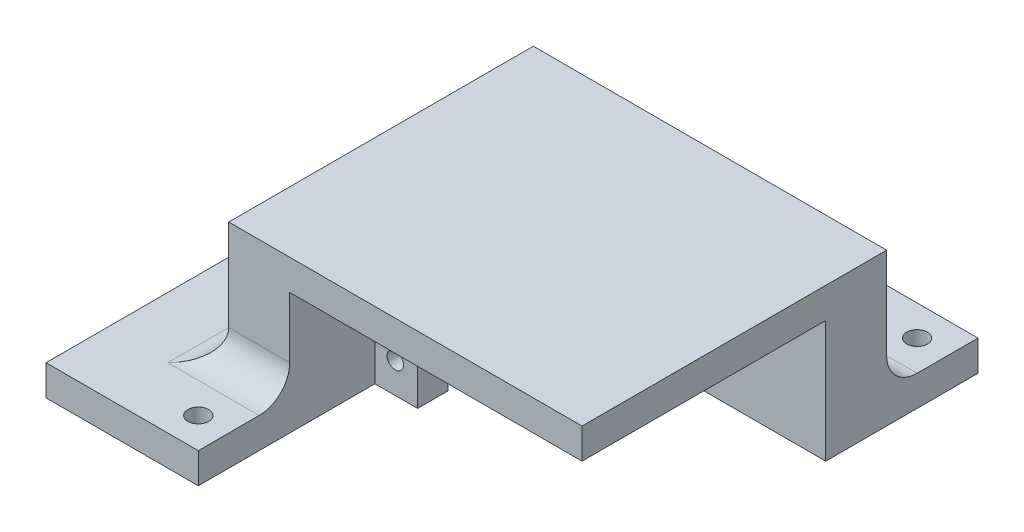
ISO-10303-21;
HEADER;
FILE_DESCRIPTION(('STEP AP214'),'2;1');
FILE_NAME('part.step','',(''),(''),'','','');
FILE_SCHEMA(('AUTOMOTIVE_DESIGN { 1 0 10303 214 1 1 1 1 }'));
ENDSEC;
DATA;
#1=APPLICATION_CONTEXT('core data for automotive mechanical design processes');
#2=APPLICATION_PROTOCOL_DEFINITION('international standard','automotive_design',2000,#1);
#3=PRODUCT_CONTEXT('',#1,'mechanical');
#4=PRODUCT('Part','Part','',(#3));
#5=PRODUCT_RELATED_PRODUCT_CATEGORY('part','',(#4));
#6=PRODUCT_DEFINITION_FORMATION('','',#4);
#7=PRODUCT_DEFINITION_CONTEXT('part definition',#1,'design');
#8=PRODUCT_DEFINITION('design','',#6,#7);
#9=PRODUCT_DEFINITION_SHAPE('','',#8);
#10=(LENGTH_UNIT() NAMED_UNIT(*) SI_UNIT(.MILLI.,.METRE.));
#11=(NAMED_UNIT(*) PLANE_ANGLE_UNIT() SI_UNIT($,.RADIAN.));
#12=(NAMED_UNIT(*) SI_UNIT($,.STERADIAN.) SOLID_ANGLE_UNIT());
#13=UNCERTAINTY_MEASURE_WITH_UNIT(LENGTH_MEASURE(1.E-05),#10,'distance_accuracy_value','');
#14=(GEOMETRIC_REPRESENTATION_CONTEXT(3) GLOBAL_UNCERTAINTY_ASSIGNED_CONTEXT((#13)) GLOBAL_UNIT_ASSIGNED_CONTEXT((#10,
#11,#12)) REPRESENTATION_CONTEXT('',''));
#15=CARTESIAN_POINT('',(0.,0.,0.));
#16=DIRECTION('',(0.,0.,1.));
#17=DIRECTION('',(1.,0.,0.));
#18=AXIS2_PLACEMENT_3D('',#15,#16,#17);
#19=CARTESIAN_POINT('',(-24.,5.,0.));
#20=DIRECTION('',(-1.,0.,0.));
#21=DIRECTION('',(0.,0.,1.));
#22=AXIS2_PLACEMENT_3D('',#19,#20,#21);
#23=PLANE('',#22);
#24=DIRECTION('',(0.,-1.,0.));
#25=VECTOR('',#24,1.);
#26=CARTESIAN_POINT('',(-24.,20.,-1.5));
#27=LINE('',#26,#25);
#28=CARTESIAN_POINT('',(-24.,20.,-1.5));
#29=VERTEX_POINT('',#28);
#30=CARTESIAN_POINT('',(-24.,0.,-1.5));
#31=VERTEX_POINT('',#30);
#32=EDGE_CURVE('E182',#29,#31,#27,.T.);
#33=ORIENTED_EDGE('',*,*,#32,.F.);
#34=DIRECTION('',(0.,0.,-1.));
#35=VECTOR('',#34,1.);
#36=CARTESIAN_POINT('',(-24.,20.,0.));
#37=LINE('',#36,#35);
#38=CARTESIAN_POINT('',(-24.,20.,12.5));
#39=VERTEX_POINT('',#38);
#40=EDGE_CURVE('E209',#39,#29,#37,.T.);
#41=ORIENTED_EDGE('',*,*,#40,.F.);
#42=DIRECTION('',(0.,-1.,0.));
#43=VECTOR('',#42,1.);
#44=CARTESIAN_POINT('',(-24.,20.,12.5));
#45=LINE('',#44,#43);
#46=CARTESIAN_POINT('',(-24.,10.,12.5));
#47=VERTEX_POINT('',#46);
#48=EDGE_CURVE('E215',#39,#47,#45,.T.);
#49=ORIENTED_EDGE('',*,*,#48,.T.);
#50=CARTESIAN_POINT('',(-24.,10.,17.5));
#51=DIRECTION('',(-1.,0.,0.));
#52=DIRECTION('',(0.,0.,1.));
#53=AXIS2_PLACEMENT_3D('',#50,#51,#52);
#54=CIRCLE('',#53,5.);
#55=CARTESIAN_POINT('',(-24.,5.,17.5));
#56=VERTEX_POINT('',#55);
#57=EDGE_CURVE('E11',#47,#56,#54,.T.);
#58=ORIENTED_EDGE('',*,*,#57,.T.);
#59=DIRECTION('',(0.,0.,-1.));
#60=VECTOR('',#59,1.);
#61=CARTESIAN_POINT('',(-24.,5.,0.));
#62=LINE('',#61,#60);
#63=CARTESIAN_POINT('',(-24.,5.,27.5));
#64=VERTEX_POINT('',#63);
#65=EDGE_CURVE('E236',#64,#56,#62,.T.);
#66=ORIENTED_EDGE('',*,*,#65,.F.);
#67=DIRECTION('',(0.,-1.,0.));
#68=VECTOR('',#67,1.);
#69=CARTESIAN_POINT('',(-24.,5.,27.5));
#70=LINE('',#69,#68);
#71=CARTESIAN_POINT('',(-24.,0.,27.5));
#72=VERTEX_POINT('',#71);
#73=EDGE_CURVE('E278',#64,#72,#70,.T.);
#74=ORIENTED_EDGE('',*,*,#73,.T.);
#75=DIRECTION('',(0.,0.,-1.));
#76=VECTOR('',#75,1.);
#77=CARTESIAN_POINT('',(-24.,0.,0.));
#78=LINE('',#77,#76);
#79=EDGE_CURVE('E259',#72,#31,#78,.T.);
#80=ORIENTED_EDGE('',*,*,#79,.T.);
#81=EDGE_LOOP('',(#33,#41,#49,#58,#66,#74,#80));
#82=FACE_BOUND('',#81,.T.);
#83=ADVANCED_FACE('F35',(#82),#23,.F.);
#84=DIRECTION('',(0.,1.,0.));
#85=VECTOR('',#84,1.);
#86=CARTESIAN_POINT('',(-24.,20.,-6.5));
#87=LINE('',#86,#85);
#88=CARTESIAN_POINT('',(-24.,0.,-6.5));
#89=VERTEX_POINT('',#88);
#90=CARTESIAN_POINT('',(-24.,20.,-6.5));
#91=VERTEX_POINT('',#90);
#92=EDGE_CURVE('E178',#89,#91,#87,.T.);
#93=ORIENTED_EDGE('',*,*,#92,.F.);
#94=CARTESIAN_POINT('',(-24.,0.,-27.5));
#95=VERTEX_POINT('',#94);
#96=EDGE_CURVE('E258',#89,#95,#78,.T.);
#97=ORIENTED_EDGE('',*,*,#96,.T.);
#98=DIRECTION('',(0.,-1.,0.));
#99=VECTOR('',#98,1.);
#100=CARTESIAN_POINT('',(-24.,5.,-27.5));
#101=LINE('',#100,#99);
#102=CARTESIAN_POINT('',(-24.,20.,-27.5));
#103=VERTEX_POINT('',#102);
#104=EDGE_CURVE('E275',#103,#95,#101,.T.);
#105=ORIENTED_EDGE('',*,*,#104,.F.);
#106=EDGE_CURVE('E208',#91,#103,#37,.T.);
#107=ORIENTED_EDGE('',*,*,#106,.F.);
#108=EDGE_LOOP('',(#93,#97,#105,#107));
#109=FACE_BOUND('',#108,.T.);
#110=ADVANCED_FACE('F333',(#109),#23,.F.);
#111=CARTESIAN_POINT('',(0.,20.,0.));
#112=DIRECTION('',(0.,1.,0.));
#113=DIRECTION('',(0.,0.,1.));
#114=AXIS2_PLACEMENT_3D('',#111,#112,#113);
#115=PLANE('',#114);
#116=DIRECTION('',(-1.,0.,0.));
#117=VECTOR('',#116,1.);
#118=CARTESIAN_POINT('',(-17.,20.,-1.5));
#119=LINE('',#118,#117);
#120=CARTESIAN_POINT('',(-17.,20.,-1.5));
#121=VERTEX_POINT('',#120);
#122=EDGE_CURVE('E322',#121,#29,#119,.T.);
#123=ORIENTED_EDGE('',*,*,#122,.F.);
#124=DIRECTION('',(0.,0.,1.));
#125=VECTOR('',#124,1.);
#126=CARTESIAN_POINT('',(-17.,20.,-1.5));
#127=LINE('',#126,#125);
#128=CARTESIAN_POINT('',(-17.,20.,-6.5));
#129=VERTEX_POINT('',#128);
#130=EDGE_CURVE('E175',#129,#121,#127,.T.);
#131=ORIENTED_EDGE('',*,*,#130,.F.);
#132=DIRECTION('',(-1.,0.,0.));
#133=VECTOR('',#132,1.);
#134=CARTESIAN_POINT('',(-17.,20.,-6.5));
#135=LINE('',#134,#133);
#136=EDGE_CURVE('E188',#129,#91,#135,.T.);
#137=ORIENTED_EDGE('',*,*,#136,.T.);
#138=ORIENTED_EDGE('',*,*,#106,.T.);
#139=DIRECTION('',(1.,0.,0.));
#140=VECTOR('',#139,1.);
#141=CARTESIAN_POINT('',(0.,20.,-27.5));
#142=LINE('',#141,#140);
#143=CARTESIAN_POINT('',(24.,20.,-27.5));
#144=VERTEX_POINT('',#143);
#145=EDGE_CURVE('E212',#103,#144,#142,.T.);
#146=ORIENTED_EDGE('',*,*,#145,.T.);
#147=DIRECTION('',(0.,0.,-1.));
#148=VECTOR('',#147,1.);
#149=CARTESIAN_POINT('',(24.,20.,-37.5));
#150=LINE('',#149,#148);
#151=CARTESIAN_POINT('',(24.,20.,12.5));
#152=VERTEX_POINT('',#151);
#153=EDGE_CURVE('E186',#152,#144,#150,.T.);
#154=ORIENTED_EDGE('',*,*,#153,.F.);
#155=DIRECTION('',(1.,0.,0.));
#156=VECTOR('',#155,1.);
#157=CARTESIAN_POINT('',(-34.,20.,12.5));
#158=LINE('',#157,#156);
#159=EDGE_CURVE('E184',#39,#152,#158,.T.);
#160=ORIENTED_EDGE('',*,*,#159,.F.);
#161=ORIENTED_EDGE('',*,*,#40,.T.);
#162=EDGE_LOOP('',(#123,#131,#137,#138,#146,#154,#160,#161));
#163=FACE_BOUND('',#162,.T.);
#164=ADVANCED_FACE('F328',(#163),#115,.F.);
#165=CARTESIAN_POINT('',(0.,5.,0.));
#166=DIRECTION('',(0.,1.,0.));
#167=DIRECTION('',(0.,0.,1.));
#168=AXIS2_PLACEMENT_3D('',#165,#166,#167);
#169=PLANE('',#168);
#170=CARTESIAN_POINT('',(19.,5.,-47.5));
#171=DIRECTION('',(0.,1.,0.));
#172=DIRECTION('',(0.,0.,1.));
#173=AXIS2_PLACEMENT_3D('',#170,#171,#172);
#174=CIRCLE('',#173,1.7);
#175=CARTESIAN_POINT('',(19.,5.,-45.8));
#176=VERTEX_POINT('',#175);
#177=EDGE_CURVE('E225',#176,#176,#174,.T.);
#178=ORIENTED_EDGE('',*,*,#177,.F.);
#179=EDGE_LOOP('',(#178));
#180=FACE_BOUND('',#179,.T.);
#181=CARTESIAN_POINT('',(-44.,5.,-47.5));
#182=DIRECTION('',(0.,1.,0.));
#183=DIRECTION('',(0.,0.,1.));
#184=AXIS2_PLACEMENT_3D('',#181,#182,#183);
#185=CIRCLE('',#184,1.7);
#186=CARTESIAN_POINT('',(-44.,5.,-45.8));
#187=VERTEX_POINT('',#186);
#188=EDGE_CURVE('E241',#187,#187,#185,.T.);
#189=ORIENTED_EDGE('',*,*,#188,.F.);
#190=EDGE_LOOP('',(#189));
#191=FACE_BOUND('',#190,.T.);
#192=CARTESIAN_POINT('',(-29.,5.,22.5));
#193=DIRECTION('',(0.,1.,0.));
#194=DIRECTION('',(0.,0.,1.));
#195=AXIS2_PLACEMENT_3D('',#192,#193,#194);
#196=CIRCLE('',#195,1.7);
#197=CARTESIAN_POINT('',(-29.,5.,24.2));
#198=VERTEX_POINT('',#197);
#199=EDGE_CURVE('E244',#198,#198,#196,.T.);
#200=ORIENTED_EDGE('',*,*,#199,.F.);
#201=EDGE_LOOP('',(#200));
#202=FACE_BOUND('',#201,.T.);
#203=DIRECTION('',(0.,0.,-1.));
#204=VECTOR('',#203,1.);
#205=CARTESIAN_POINT('',(-39.,5.,-37.5));
#206=LINE('',#205,#204);
#207=CARTESIAN_POINT('',(-39.,5.,17.5));
#208=VERTEX_POINT('',#207);
#209=CARTESIAN_POINT('',(-39.,5.,-42.5));
#210=VERTEX_POINT('',#209);
#211=EDGE_CURVE('E295',#208,#210,#206,.T.);
#212=ORIENTED_EDGE('',*,*,#211,.T.);
#213=DIRECTION('',(-1.,0.,0.));
#214=VECTOR('',#213,1.);
#215=CARTESIAN_POINT('',(0.,5.,-42.5));
#216=LINE('',#215,#214);
#217=CARTESIAN_POINT('',(24.,5.,-42.5));
#218=VERTEX_POINT('',#217);
#219=EDGE_CURVE('E299',#210,#218,#216,.F.);
#220=ORIENTED_EDGE('',*,*,#219,.T.);
#221=DIRECTION('',(0.,0.,-1.));
#222=VECTOR('',#221,1.);
#223=CARTESIAN_POINT('',(24.,5.,0.));
#224=LINE('',#223,#222);
#225=CARTESIAN_POINT('',(24.,5.,-52.5));
#226=VERTEX_POINT('',#225);
#227=EDGE_CURVE('E239',#218,#226,#224,.T.);
#228=ORIENTED_EDGE('',*,*,#227,.T.);
#229=DIRECTION('',(-1.,0.,0.));
#230=VECTOR('',#229,1.);
#231=CARTESIAN_POINT('',(0.,5.,-52.5));
#232=LINE('',#231,#230);
#233=CARTESIAN_POINT('',(-49.,5.,-52.5));
#234=VERTEX_POINT('',#233);
#235=EDGE_CURVE('E228',#226,#234,#232,.T.);
#236=ORIENTED_EDGE('',*,*,#235,.T.);
#237=DIRECTION('',(0.,0.,-1.));
#238=VECTOR('',#237,1.);
#239=CARTESIAN_POINT('',(-49.,5.,0.));
#240=LINE('',#239,#238);
#241=CARTESIAN_POINT('',(-49.,5.,27.5));
#242=VERTEX_POINT('',#241);
#243=EDGE_CURVE('E231',#242,#234,#240,.T.);
#244=ORIENTED_EDGE('',*,*,#243,.F.);
#245=DIRECTION('',(1.,0.,0.));
#246=VECTOR('',#245,1.);
#247=CARTESIAN_POINT('',(0.,5.,27.5));
#248=LINE('',#247,#246);
#249=EDGE_CURVE('E234',#242,#64,#248,.T.);
#250=ORIENTED_EDGE('',*,*,#249,.T.);
#251=ORIENTED_EDGE('',*,*,#65,.T.);
#252=DIRECTION('',(-1.,0.,0.));
#253=VECTOR('',#252,1.);
#254=CARTESIAN_POINT('',(-34.,5.,17.5));
#255=LINE('',#254,#253);
#256=EDGE_CURVE('E297',#56,#208,#255,.T.);
#257=ORIENTED_EDGE('',*,*,#256,.T.);
#258=EDGE_LOOP('',(#212,#220,#228,#236,#244,#250,#251,#257));
#259=FACE_BOUND('',#258,.T.);
#260=ADVANCED_FACE('F367',(#180,#191,#202,#259),#169,.T.);
#261=CARTESIAN_POINT('',(0.,5.,-52.5));
#262=DIRECTION('',(0.,0.,1.));
#263=DIRECTION('',(1.,0.,0.));
#264=AXIS2_PLACEMENT_3D('',#261,#262,#263);
#265=PLANE('',#264);
#266=DIRECTION('',(-1.,0.,0.));
#267=VECTOR('',#266,1.);
#268=CARTESIAN_POINT('',(0.,0.,-52.5));
#269=LINE('',#268,#267);
#270=CARTESIAN_POINT('',(24.,0.,-52.5));
#271=VERTEX_POINT('',#270);
#272=CARTESIAN_POINT('',(-49.,0.,-52.5));
#273=VERTEX_POINT('',#272);
#274=EDGE_CURVE('E250',#271,#273,#269,.T.);
#275=ORIENTED_EDGE('',*,*,#274,.T.);
#276=DIRECTION('',(0.,-1.,0.));
#277=VECTOR('',#276,1.);
#278=CARTESIAN_POINT('',(-49.,5.,-52.5));
#279=LINE('',#278,#277);
#280=EDGE_CURVE('E283',#234,#273,#279,.T.);
#281=ORIENTED_EDGE('',*,*,#280,.F.);
#282=ORIENTED_EDGE('',*,*,#235,.F.);
#283=DIRECTION('',(0.,-1.,0.));
#284=VECTOR('',#283,1.);
#285=CARTESIAN_POINT('',(24.,5.,-52.5));
#286=LINE('',#285,#284);
#287=EDGE_CURVE('E247',#226,#271,#286,.T.);
#288=ORIENTED_EDGE('',*,*,#287,.T.);
#289=EDGE_LOOP('',(#275,#281,#282,#288));
#290=FACE_BOUND('',#289,.T.);
#291=ADVANCED_FACE('F362',(#290),#265,.F.);
#292=CARTESIAN_POINT('',(-49.,5.,0.));
#293=DIRECTION('',(-1.,0.,0.));
#294=DIRECTION('',(0.,0.,1.));
#295=AXIS2_PLACEMENT_3D('',#292,#293,#294);
#296=PLANE('',#295);
#297=DIRECTION('',(0.,0.,-1.));
#298=VECTOR('',#297,1.);
#299=CARTESIAN_POINT('',(-49.,0.,0.));
#300=LINE('',#299,#298);
#301=CARTESIAN_POINT('',(-49.,0.,27.5));
#302=VERTEX_POINT('',#301);
#303=EDGE_CURVE('E253',#302,#273,#300,.T.);
#304=ORIENTED_EDGE('',*,*,#303,.F.);
#305=DIRECTION('',(0.,-1.,0.));
#306=VECTOR('',#305,1.);
#307=CARTESIAN_POINT('',(-49.,5.,27.5));
#308=LINE('',#307,#306);
#309=EDGE_CURVE('E281',#242,#302,#308,.T.);
#310=ORIENTED_EDGE('',*,*,#309,.F.);
#311=ORIENTED_EDGE('',*,*,#243,.T.);
#312=ORIENTED_EDGE('',*,*,#280,.T.);
#313=EDGE_LOOP('',(#304,#310,#311,#312));
#314=FACE_BOUND('',#313,.T.);
#315=ADVANCED_FACE('F356',(#314),#296,.T.);
#316=CARTESIAN_POINT('',(0.,5.,27.5));
#317=DIRECTION('',(0.,0.,-1.));
#318=DIRECTION('',(-1.,0.,0.));
#319=AXIS2_PLACEMENT_3D('',#316,#317,#318);
#320=PLANE('',#319);
#321=DIRECTION('',(1.,0.,0.));
#322=VECTOR('',#321,1.);
#323=CARTESIAN_POINT('',(0.,0.,27.5));
#324=LINE('',#323,#322);
#325=EDGE_CURVE('E256',#302,#72,#324,.T.);
#326=ORIENTED_EDGE('',*,*,#325,.T.);
#327=ORIENTED_EDGE('',*,*,#73,.F.);
#328=ORIENTED_EDGE('',*,*,#249,.F.);
#329=ORIENTED_EDGE('',*,*,#309,.T.);
#330=EDGE_LOOP('',(#326,#327,#328,#329));
#331=FACE_BOUND('',#330,.T.);
#332=ADVANCED_FACE('F396',(#331),#320,.F.);
#333=CARTESIAN_POINT('',(0.,5.,-27.5));
#334=DIRECTION('',(0.,0.,-1.));
#335=DIRECTION('',(-1.,0.,0.));
#336=AXIS2_PLACEMENT_3D('',#333,#334,#335);
#337=PLANE('',#336);
#338=DIRECTION('',(1.,0.,0.));
#339=VECTOR('',#338,1.);
#340=CARTESIAN_POINT('',(0.,0.,-27.5));
#341=LINE('',#340,#339);
#342=CARTESIAN_POINT('',(24.,0.,-27.5));
#343=VERTEX_POINT('',#342);
#344=EDGE_CURVE('E261',#95,#343,#341,.T.);
#345=ORIENTED_EDGE('',*,*,#344,.T.);
#346=DIRECTION('',(0.,-1.,0.));
#347=VECTOR('',#346,1.);
#348=CARTESIAN_POINT('',(24.,5.,-27.5));
#349=LINE('',#348,#347);
#350=EDGE_CURVE('E272',#144,#343,#349,.T.);
#351=ORIENTED_EDGE('',*,*,#350,.F.);
#352=ORIENTED_EDGE('',*,*,#145,.F.);
#353=ORIENTED_EDGE('',*,*,#104,.T.);
#354=EDGE_LOOP('',(#345,#351,#352,#353));
#355=FACE_BOUND('',#354,.T.);
#356=ADVANCED_FACE('F337',(#355),#337,.F.);
#357=CARTESIAN_POINT('',(-44.,5.,-47.5));
#358=DIRECTION('',(0.,-1.,0.));
#359=DIRECTION('',(0.,0.,-1.));
#360=AXIS2_PLACEMENT_3D('',#357,#358,#359);
#361=CYLINDRICAL_SURFACE('',#360,1.7);
#362=ORIENTED_EDGE('',*,*,#188,.T.);
#363=EDGE_LOOP('',(#362));
#364=FACE_BOUND('',#363,.T.);
#365=CARTESIAN_POINT('',(-44.,0.,-47.5));
#366=DIRECTION('',(0.,1.,0.));
#367=DIRECTION('',(0.,0.,1.));
#368=AXIS2_PLACEMENT_3D('',#365,#366,#367);
#369=CIRCLE('',#368,1.7);
#370=CARTESIAN_POINT('',(-44.,0.,-45.8));
#371=VERTEX_POINT('',#370);
#372=EDGE_CURVE('E265',#371,#371,#369,.T.);
#373=ORIENTED_EDGE('',*,*,#372,.F.);
#374=EDGE_LOOP('',(#373));
#375=FACE_BOUND('',#374,.T.);
#376=ADVANCED_FACE('F481',(#364,#375),#361,.F.);
#377=CARTESIAN_POINT('',(24.,5.,0.));
#378=DIRECTION('',(-1.,0.,0.));
#379=DIRECTION('',(0.,0.,1.));
#380=AXIS2_PLACEMENT_3D('',#377,#378,#379);
#381=PLANE('',#380);
#382=DIRECTION('',(0.,0.,-1.));
#383=VECTOR('',#382,1.);
#384=CARTESIAN_POINT('',(24.,0.,0.));
#385=LINE('',#384,#383);
#386=EDGE_CURVE('E263',#343,#271,#385,.T.);
#387=ORIENTED_EDGE('',*,*,#386,.T.);
#388=ORIENTED_EDGE('',*,*,#287,.F.);
#389=ORIENTED_EDGE('',*,*,#227,.F.);
#390=CARTESIAN_POINT('',(24.,10.,-42.5));
#391=DIRECTION('',(-1.,0.,0.));
#392=DIRECTION('',(0.,0.,1.));
#393=AXIS2_PLACEMENT_3D('',#390,#391,#392);
#394=CIRCLE('',#393,5.);
#395=CARTESIAN_POINT('',(24.,10.,-37.5));
#396=VERTEX_POINT('',#395);
#397=EDGE_CURVE('E44',#218,#396,#394,.T.);
#398=ORIENTED_EDGE('',*,*,#397,.T.);
#399=DIRECTION('',(0.,-1.,0.));
#400=VECTOR('',#399,1.);
#401=CARTESIAN_POINT('',(24.,20.,-37.5));
#402=LINE('',#401,#400);
#403=CARTESIAN_POINT('',(24.,25.,-37.5));
#404=VERTEX_POINT('',#403);
#405=EDGE_CURVE('E221',#404,#396,#402,.T.);
#406=ORIENTED_EDGE('',*,*,#405,.F.);
#407=DIRECTION('',(0.,0.,-1.));
#408=VECTOR('',#407,1.);
#409=CARTESIAN_POINT('',(24.,25.,-37.5));
#410=LINE('',#409,#408);
#411=CARTESIAN_POINT('',(24.,25.,12.5));
#412=VERTEX_POINT('',#411);
#413=EDGE_CURVE('E197',#412,#404,#410,.T.);
#414=ORIENTED_EDGE('',*,*,#413,.F.);
#415=DIRECTION('',(0.,-1.,0.));
#416=VECTOR('',#415,1.);
#417=CARTESIAN_POINT('',(24.,25.,12.5));
#418=LINE('',#417,#416);
#419=EDGE_CURVE('E202',#412,#152,#418,.T.);
#420=ORIENTED_EDGE('',*,*,#419,.T.);
#421=ORIENTED_EDGE('',*,*,#153,.T.);
#422=ORIENTED_EDGE('',*,*,#350,.T.);
#423=EDGE_LOOP('',(#387,#388,#389,#398,#406,#414,#420,#421,#422));
#424=FACE_BOUND('',#423,.T.);
#425=ADVANCED_FACE('F341',(#424),#381,.F.);
#426=CARTESIAN_POINT('',(19.,5.,-47.5));
#427=DIRECTION('',(0.,-1.,0.));
#428=DIRECTION('',(0.,0.,-1.));
#429=AXIS2_PLACEMENT_3D('',#426,#427,#428);
#430=CYLINDRICAL_SURFACE('',#429,1.7);
#431=ORIENTED_EDGE('',*,*,#177,.T.);
#432=EDGE_LOOP('',(#431));
#433=FACE_BOUND('',#432,.T.);
#434=CARTESIAN_POINT('',(19.,0.,-47.5));
#435=DIRECTION('',(0.,1.,0.));
#436=DIRECTION('',(0.,0.,1.));
#437=AXIS2_PLACEMENT_3D('',#434,#435,#436);
#438=CIRCLE('',#437,1.7);
#439=CARTESIAN_POINT('',(19.,0.,-45.8));
#440=VERTEX_POINT('',#439);
#441=EDGE_CURVE('E224',#440,#440,#438,.T.);
#442=ORIENTED_EDGE('',*,*,#441,.F.);
#443=EDGE_LOOP('',(#442));
#444=FACE_BOUND('',#443,.T.);
#445=ADVANCED_FACE('F403',(#433,#444),#430,.F.);
#446=CARTESIAN_POINT('',(-29.,5.,22.5));
#447=DIRECTION('',(0.,-1.,0.));
#448=DIRECTION('',(0.,0.,-1.));
#449=AXIS2_PLACEMENT_3D('',#446,#447,#448);
#450=CYLINDRICAL_SURFACE('',#449,1.7);
#451=ORIENTED_EDGE('',*,*,#199,.T.);
#452=EDGE_LOOP('',(#451));
#453=FACE_BOUND('',#452,.T.);
#454=CARTESIAN_POINT('',(-29.,0.,22.5));
#455=DIRECTION('',(0.,1.,0.));
#456=DIRECTION('',(0.,0.,1.));
#457=AXIS2_PLACEMENT_3D('',#454,#455,#456);
#458=CIRCLE('',#457,1.7);
#459=CARTESIAN_POINT('',(-29.,0.,24.2));
#460=VERTEX_POINT('',#459);
#461=EDGE_CURVE('E229',#460,#460,#458,.T.);
#462=ORIENTED_EDGE('',*,*,#461,.F.);
#463=EDGE_LOOP('',(#462));
#464=FACE_BOUND('',#463,.T.);
#465=ADVANCED_FACE('F406',(#453,#464),#450,.F.);
#466=CARTESIAN_POINT('',(0.,0.,0.));
#467=DIRECTION('',(0.,1.,0.));
#468=DIRECTION('',(0.,0.,1.));
#469=AXIS2_PLACEMENT_3D('',#466,#467,#468);
#470=PLANE('',#469);
#471=ORIENTED_EDGE('',*,*,#441,.T.);
#472=EDGE_LOOP('',(#471));
#473=FACE_BOUND('',#472,.T.);
#474=ORIENTED_EDGE('',*,*,#274,.F.);
#475=ORIENTED_EDGE('',*,*,#386,.F.);
#476=ORIENTED_EDGE('',*,*,#344,.F.);
#477=ORIENTED_EDGE('',*,*,#96,.F.);
#478=DIRECTION('',(-1.,0.,0.));
#479=VECTOR('',#478,1.);
#480=CARTESIAN_POINT('',(-17.,0.,-6.5));
#481=LINE('',#480,#479);
#482=CARTESIAN_POINT('',(-17.,0.,-6.5));
#483=VERTEX_POINT('',#482);
#484=EDGE_CURVE('E165',#483,#89,#481,.T.);
#485=ORIENTED_EDGE('',*,*,#484,.F.);
#486=DIRECTION('',(0.,0.,-1.));
#487=VECTOR('',#486,1.);
#488=CARTESIAN_POINT('',(-17.,0.,-1.5));
#489=LINE('',#488,#487);
#490=CARTESIAN_POINT('',(-17.,0.,-1.5));
#491=VERTEX_POINT('',#490);
#492=EDGE_CURVE('E155',#491,#483,#489,.T.);
#493=ORIENTED_EDGE('',*,*,#492,.F.);
#494=DIRECTION('',(-1.,0.,0.));
#495=VECTOR('',#494,1.);
#496=CARTESIAN_POINT('',(-17.,0.,-1.5));
#497=LINE('',#496,#495);
#498=EDGE_CURVE('E162',#491,#31,#497,.T.);
#499=ORIENTED_EDGE('',*,*,#498,.T.);
#500=ORIENTED_EDGE('',*,*,#79,.F.);
#501=ORIENTED_EDGE('',*,*,#325,.F.);
#502=ORIENTED_EDGE('',*,*,#303,.T.);
#503=EDGE_LOOP('',(#474,#475,#476,#477,#485,#493,#499,#500,#501,#502));
#504=FACE_BOUND('',#503,.T.);
#505=ORIENTED_EDGE('',*,*,#372,.T.);
#506=EDGE_LOOP('',(#505));
#507=FACE_BOUND('',#506,.T.);
#508=ORIENTED_EDGE('',*,*,#461,.T.);
#509=EDGE_LOOP('',(#508));
#510=FACE_BOUND('',#509,.T.);
#511=ADVANCED_FACE('F158',(#473,#504,#507,#510),#470,.F.);
#512=CARTESIAN_POINT('',(0.,20.,-37.5));
#513=DIRECTION('',(0.,0.,1.));
#514=DIRECTION('',(1.,0.,0.));
#515=AXIS2_PLACEMENT_3D('',#512,#513,#514);
#516=PLANE('',#515);
#517=ORIENTED_EDGE('',*,*,#405,.T.);
#518=DIRECTION('',(-1.,0.,0.));
#519=VECTOR('',#518,1.);
#520=CARTESIAN_POINT('',(0.,10.,-37.5));
#521=LINE('',#520,#519);
#522=CARTESIAN_POINT('',(-34.,10.,-37.5));
#523=VERTEX_POINT('',#522);
#524=EDGE_CURVE('E285',#396,#523,#521,.T.);
#525=ORIENTED_EDGE('',*,*,#524,.T.);
#526=DIRECTION('',(0.,-1.,0.));
#527=VECTOR('',#526,1.);
#528=CARTESIAN_POINT('',(-34.,20.,-37.5));
#529=LINE('',#528,#527);
#530=CARTESIAN_POINT('',(-34.,25.,-37.5));
#531=VERTEX_POINT('',#530);
#532=EDGE_CURVE('E219',#531,#523,#529,.T.);
#533=ORIENTED_EDGE('',*,*,#532,.F.);
#534=DIRECTION('',(-1.,0.,0.));
#535=VECTOR('',#534,1.);
#536=CARTESIAN_POINT('',(-34.,25.,-37.5));
#537=LINE('',#536,#535);
#538=EDGE_CURVE('E200',#404,#531,#537,.T.);
#539=ORIENTED_EDGE('',*,*,#538,.F.);
#540=EDGE_LOOP('',(#517,#525,#533,#539));
#541=FACE_BOUND('',#540,.T.);
#542=ADVANCED_FACE('F371',(#541),#516,.F.);
#543=CARTESIAN_POINT('',(-34.,20.,0.));
#544=DIRECTION('',(-1.,0.,0.));
#545=DIRECTION('',(0.,0.,1.));
#546=AXIS2_PLACEMENT_3D('',#543,#544,#545);
#547=PLANE('',#546);
#548=ORIENTED_EDGE('',*,*,#532,.T.);
#549=DIRECTION('',(0.,0.,-1.));
#550=VECTOR('',#549,1.);
#551=CARTESIAN_POINT('',(-34.,10.,12.5));
#552=LINE('',#551,#550);
#553=CARTESIAN_POINT('',(-34.,10.,12.5));
#554=VERTEX_POINT('',#553);
#555=EDGE_CURVE('E52',#523,#554,#552,.F.);
#556=ORIENTED_EDGE('',*,*,#555,.T.);
#557=DIRECTION('',(0.,-1.,0.));
#558=VECTOR('',#557,1.);
#559=CARTESIAN_POINT('',(-34.,20.,12.5));
#560=LINE('',#559,#558);
#561=CARTESIAN_POINT('',(-34.,25.,12.5));
#562=VERTEX_POINT('',#561);
#563=EDGE_CURVE('E217',#562,#554,#560,.T.);
#564=ORIENTED_EDGE('',*,*,#563,.F.);
#565=DIRECTION('',(0.,0.,1.));
#566=VECTOR('',#565,1.);
#567=CARTESIAN_POINT('',(-34.,25.,-37.5));
#568=LINE('',#567,#566);
#569=EDGE_CURVE('E192',#531,#562,#568,.T.);
#570=ORIENTED_EDGE('',*,*,#569,.F.);
#571=EDGE_LOOP('',(#548,#556,#564,#570));
#572=FACE_BOUND('',#571,.T.);
#573=ADVANCED_FACE('F374',(#572),#547,.T.);
#574=CARTESIAN_POINT('',(0.,20.,12.5));
#575=DIRECTION('',(0.,0.,1.));
#576=DIRECTION('',(1.,0.,0.));
#577=AXIS2_PLACEMENT_3D('',#574,#575,#576);
#578=PLANE('',#577);
#579=ORIENTED_EDGE('',*,*,#563,.T.);
#580=DIRECTION('',(-1.,0.,0.));
#581=VECTOR('',#580,1.);
#582=CARTESIAN_POINT('',(-24.,10.,12.5));
#583=LINE('',#582,#581);
#584=EDGE_CURVE('E59',#554,#47,#583,.F.);
#585=ORIENTED_EDGE('',*,*,#584,.T.);
#586=ORIENTED_EDGE('',*,*,#48,.F.);
#587=ORIENTED_EDGE('',*,*,#159,.T.);
#588=ORIENTED_EDGE('',*,*,#419,.F.);
#589=DIRECTION('',(1.,0.,0.));
#590=VECTOR('',#589,1.);
#591=CARTESIAN_POINT('',(-34.,25.,12.5));
#592=LINE('',#591,#590);
#593=EDGE_CURVE('E195',#562,#412,#592,.T.);
#594=ORIENTED_EDGE('',*,*,#593,.F.);
#595=EDGE_LOOP('',(#579,#585,#586,#587,#588,#594));
#596=FACE_BOUND('',#595,.T.);
#597=ADVANCED_FACE('F346',(#596),#578,.T.);
#598=CARTESIAN_POINT('',(0.,25.,0.));
#599=DIRECTION('',(0.,1.,0.));
#600=DIRECTION('',(0.,0.,1.));
#601=AXIS2_PLACEMENT_3D('',#598,#599,#600);
#602=PLANE('',#601);
#603=ORIENTED_EDGE('',*,*,#569,.T.);
#604=ORIENTED_EDGE('',*,*,#593,.T.);
#605=ORIENTED_EDGE('',*,*,#413,.T.);
#606=ORIENTED_EDGE('',*,*,#538,.T.);
#607=EDGE_LOOP('',(#603,#604,#605,#606));
#608=FACE_BOUND('',#607,.T.);
#609=ADVANCED_FACE('F376',(#608),#602,.T.);
#610=CARTESIAN_POINT('',(-17.,20.,-1.5));
#611=DIRECTION('',(0.,0.,-1.));
#612=DIRECTION('',(0.,1.,0.));
#613=AXIS2_PLACEMENT_3D('',#610,#611,#612);
#614=PLANE('',#613);
#615=CARTESIAN_POINT('',(-20.65,5.,-1.5));
#616=DIRECTION('',(0.,0.,1.));
#617=DIRECTION('',(1.,0.,0.));
#618=AXIS2_PLACEMENT_3D('',#615,#616,#617);
#619=CIRCLE('',#618,1.35);
#620=CARTESIAN_POINT('',(-19.3,5.,-1.5));
#621=VERTEX_POINT('',#620);
#622=EDGE_CURVE('E290',#621,#621,#619,.T.);
#623=ORIENTED_EDGE('',*,*,#622,.F.);
#624=EDGE_LOOP('',(#623));
#625=FACE_BOUND('',#624,.T.);
#626=CARTESIAN_POINT('',(-20.65,15.,-1.5));
#627=DIRECTION('',(0.,0.,1.));
#628=DIRECTION('',(1.,0.,0.));
#629=AXIS2_PLACEMENT_3D('',#626,#627,#628);
#630=CIRCLE('',#629,1.35);
#631=CARTESIAN_POINT('',(-19.3,15.,-1.5));
#632=VERTEX_POINT('',#631);
#633=EDGE_CURVE('E309',#632,#632,#630,.T.);
#634=ORIENTED_EDGE('',*,*,#633,.F.);
#635=EDGE_LOOP('',(#634));
#636=FACE_BOUND('',#635,.T.);
#637=ORIENTED_EDGE('',*,*,#32,.T.);
#638=ORIENTED_EDGE('',*,*,#498,.F.);
#639=DIRECTION('',(0.,-1.,0.));
#640=VECTOR('',#639,1.);
#641=CARTESIAN_POINT('',(-17.,20.,-1.5));
#642=LINE('',#641,#640);
#643=EDGE_CURVE('E170',#121,#491,#642,.T.);
#644=ORIENTED_EDGE('',*,*,#643,.F.);
#645=ORIENTED_EDGE('',*,*,#122,.T.);
#646=EDGE_LOOP('',(#637,#638,#644,#645));
#647=FACE_BOUND('',#646,.T.);
#648=ADVANCED_FACE('F180',(#625,#636,#647),#614,.F.);
#649=CARTESIAN_POINT('',(-17.,20.,-6.5));
#650=DIRECTION('',(0.,0.,1.));
#651=DIRECTION('',(0.,-1.,0.));
#652=AXIS2_PLACEMENT_3D('',#649,#650,#651);
#653=PLANE('',#652);
#654=CARTESIAN_POINT('',(-20.65,5.,-6.5));
#655=DIRECTION('',(0.,0.,1.));
#656=DIRECTION('',(0.,-1.,0.));
#657=AXIS2_PLACEMENT_3D('',#654,#655,#656);
#658=CIRCLE('',#657,1.35);
#659=CARTESIAN_POINT('',(-20.65,3.65,-6.5));
#660=VERTEX_POINT('',#659);
#661=EDGE_CURVE('E289',#660,#660,#658,.T.);
#662=ORIENTED_EDGE('',*,*,#661,.T.);
#663=EDGE_LOOP('',(#662));
#664=FACE_BOUND('',#663,.T.);
#665=CARTESIAN_POINT('',(-20.65,15.,-6.5));
#666=DIRECTION('',(0.,0.,1.));
#667=DIRECTION('',(0.,-1.,0.));
#668=AXIS2_PLACEMENT_3D('',#665,#666,#667);
#669=CIRCLE('',#668,1.35);
#670=CARTESIAN_POINT('',(-20.65,13.65,-6.5));
#671=VERTEX_POINT('',#670);
#672=EDGE_CURVE('E286',#671,#671,#669,.T.);
#673=ORIENTED_EDGE('',*,*,#672,.T.);
#674=EDGE_LOOP('',(#673));
#675=FACE_BOUND('',#674,.T.);
#676=ORIENTED_EDGE('',*,*,#92,.T.);
#677=ORIENTED_EDGE('',*,*,#136,.F.);
#678=DIRECTION('',(0.,1.,0.));
#679=VECTOR('',#678,1.);
#680=CARTESIAN_POINT('',(-17.,20.,-6.5));
#681=LINE('',#680,#679);
#682=EDGE_CURVE('E169',#483,#129,#681,.T.);
#683=ORIENTED_EDGE('',*,*,#682,.F.);
#684=ORIENTED_EDGE('',*,*,#484,.T.);
#685=EDGE_LOOP('',(#676,#677,#683,#684));
#686=FACE_BOUND('',#685,.T.);
#687=ADVANCED_FACE('F383',(#664,#675,#686),#653,.F.);
#688=CARTESIAN_POINT('',(-17.,0.,0.));
#689=DIRECTION('',(1.,0.,0.));
#690=DIRECTION('',(0.,0.,-1.));
#691=AXIS2_PLACEMENT_3D('',#688,#689,#690);
#692=PLANE('',#691);
#693=ORIENTED_EDGE('',*,*,#643,.T.);
#694=ORIENTED_EDGE('',*,*,#492,.T.);
#695=ORIENTED_EDGE('',*,*,#682,.T.);
#696=ORIENTED_EDGE('',*,*,#130,.T.);
#697=EDGE_LOOP('',(#693,#694,#695,#696));
#698=FACE_BOUND('',#697,.T.);
#699=ADVANCED_FACE('F173',(#698),#692,.T.);
#700=CARTESIAN_POINT('',(-20.65,15.,-8.5));
#701=DIRECTION('',(0.,0.,1.));
#702=DIRECTION('',(1.,0.,0.));
#703=AXIS2_PLACEMENT_3D('',#700,#701,#702);
#704=CYLINDRICAL_SURFACE('',#703,1.35);
#705=ORIENTED_EDGE('',*,*,#633,.T.);
#706=EDGE_LOOP('',(#705));
#707=FACE_BOUND('',#706,.T.);
#708=ORIENTED_EDGE('',*,*,#672,.F.);
#709=EDGE_LOOP('',(#708));
#710=FACE_BOUND('',#709,.T.);
#711=ADVANCED_FACE('F418',(#707,#710),#704,.F.);
#712=CARTESIAN_POINT('',(-20.65,5.,-8.5));
#713=DIRECTION('',(0.,0.,1.));
#714=DIRECTION('',(1.,0.,0.));
#715=AXIS2_PLACEMENT_3D('',#712,#713,#714);
#716=CYLINDRICAL_SURFACE('',#715,1.35);
#717=ORIENTED_EDGE('',*,*,#622,.T.);
#718=EDGE_LOOP('',(#717));
#719=FACE_BOUND('',#718,.T.);
#720=ORIENTED_EDGE('',*,*,#661,.F.);
#721=EDGE_LOOP('',(#720));
#722=FACE_BOUND('',#721,.T.);
#723=ADVANCED_FACE('F413',(#719,#722),#716,.F.);
#724=CARTESIAN_POINT('',(0.,10.,17.5));
#725=DIRECTION('',(1.,0.,0.));
#726=DIRECTION('',(0.,0.,-1.));
#727=AXIS2_PLACEMENT_3D('',#724,#725,#726);
#728=CYLINDRICAL_SURFACE('',#727,5.);
#729=ORIENTED_EDGE('',*,*,#57,.F.);
#730=ORIENTED_EDGE('',*,*,#584,.F.);
#731=CARTESIAN_POINT('',(-39.,10.,17.5));
#732=DIRECTION('',(0.707106781186548,0.,0.707106781186547));
#733=DIRECTION('',(-0.707106781186547,0.,0.707106781186548));
#734=AXIS2_PLACEMENT_3D('',#731,#732,#733);
#735=ELLIPSE('',#734,7.07106781186548,5.);
#736=EDGE_CURVE('E39',#208,#554,#735,.T.);
#737=ORIENTED_EDGE('',*,*,#736,.F.);
#738=ORIENTED_EDGE('',*,*,#256,.F.);
#739=EDGE_LOOP('',(#729,#730,#737,#738));
#740=FACE_BOUND('',#739,.T.);
#741=ADVANCED_FACE('F37',(#740),#728,.F.);
#742=CARTESIAN_POINT('',(-39.,10.,0.));
#743=DIRECTION('',(0.,0.,1.));
#744=DIRECTION('',(1.,0.,0.));
#745=AXIS2_PLACEMENT_3D('',#742,#743,#744);
#746=CYLINDRICAL_SURFACE('',#745,5.);
#747=ORIENTED_EDGE('',*,*,#736,.T.);
#748=ORIENTED_EDGE('',*,*,#555,.F.);
#749=CARTESIAN_POINT('',(-39.,10.,-42.5));
#750=DIRECTION('',(-0.707106781186547,0.,0.707106781186548));
#751=DIRECTION('',(0.707106781186548,0.,0.707106781186547));
#752=AXIS2_PLACEMENT_3D('',#749,#750,#751);
#753=ELLIPSE('',#752,7.07106781186547,5.);
#754=EDGE_CURVE('E303',#210,#523,#753,.T.);
#755=ORIENTED_EDGE('',*,*,#754,.F.);
#756=ORIENTED_EDGE('',*,*,#211,.F.);
#757=EDGE_LOOP('',(#747,#748,#755,#756));
#758=FACE_BOUND('',#757,.T.);
#759=ADVANCED_FACE('F369',(#758),#746,.F.);
#760=CARTESIAN_POINT('',(0.,10.,-42.5));
#761=DIRECTION('',(-1.,0.,0.));
#762=DIRECTION('',(0.,0.,1.));
#763=AXIS2_PLACEMENT_3D('',#760,#761,#762);
#764=CYLINDRICAL_SURFACE('',#763,5.);
#765=ORIENTED_EDGE('',*,*,#397,.F.);
#766=ORIENTED_EDGE('',*,*,#219,.F.);
#767=ORIENTED_EDGE('',*,*,#754,.T.);
#768=ORIENTED_EDGE('',*,*,#524,.F.);
#769=EDGE_LOOP('',(#765,#766,#767,#768));
#770=FACE_BOUND('',#769,.T.);
#771=ADVANCED_FACE('F368',(#770),#764,.F.);
#772=CLOSED_SHELL('',(#83,#110,#164,#260,#291,#315,#332,#356,#376,#425,#445,#465,#511,#542,#573,
#597,#609,#648,#687,#699,#711,#723,#741,#759,#771));
#773=MANIFOLD_SOLID_BREP('B2',#772);
#774=ADVANCED_BREP_SHAPE_REPRESENTATION('',(#18,#773),#14);
#775=SHAPE_DEFINITION_REPRESENTATION(#9,#774);
ENDSEC;
END-ISO-10303-21;
